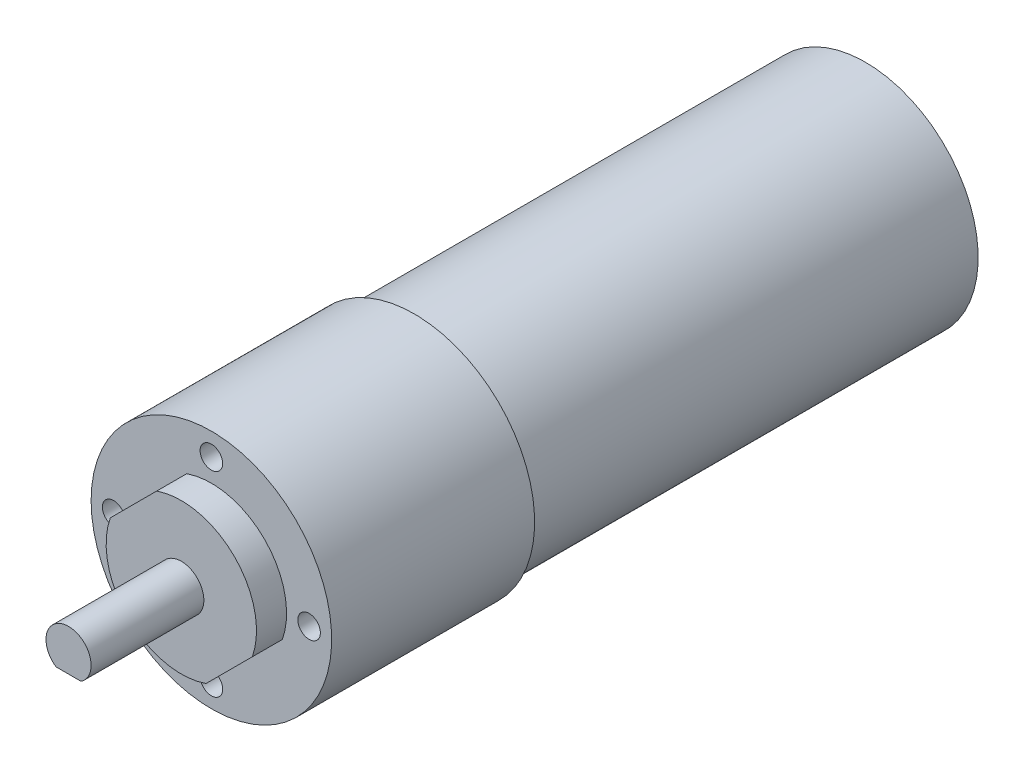
ISO-10303-21;
HEADER;
FILE_DESCRIPTION(('STEP AP214'),'2;1');
FILE_NAME('part.step','',(''),(''),'','','');
FILE_SCHEMA(('AUTOMOTIVE_DESIGN { 1 0 10303 214 1 1 1 1 }'));
ENDSEC;
DATA;
#1=APPLICATION_CONTEXT('core data for automotive mechanical design processes');
#2=APPLICATION_PROTOCOL_DEFINITION('international standard','automotive_design',2000,#1);
#3=PRODUCT_CONTEXT('',#1,'mechanical');
#4=PRODUCT('Part','Part','',(#3));
#5=PRODUCT_RELATED_PRODUCT_CATEGORY('part','',(#4));
#6=PRODUCT_DEFINITION_FORMATION('','',#4);
#7=PRODUCT_DEFINITION_CONTEXT('part definition',#1,'design');
#8=PRODUCT_DEFINITION('design','',#6,#7);
#9=PRODUCT_DEFINITION_SHAPE('','',#8);
#10=(LENGTH_UNIT() NAMED_UNIT(*) SI_UNIT(.MILLI.,.METRE.));
#11=(NAMED_UNIT(*) PLANE_ANGLE_UNIT() SI_UNIT($,.RADIAN.));
#12=(NAMED_UNIT(*) SI_UNIT($,.STERADIAN.) SOLID_ANGLE_UNIT());
#13=UNCERTAINTY_MEASURE_WITH_UNIT(LENGTH_MEASURE(1.E-05),#10,'distance_accuracy_value','');
#14=(GEOMETRIC_REPRESENTATION_CONTEXT(3) GLOBAL_UNCERTAINTY_ASSIGNED_CONTEXT((#13)) GLOBAL_UNIT_ASSIGNED_CONTEXT((#10,
#11,#12)) REPRESENTATION_CONTEXT('',''));
#15=CARTESIAN_POINT('',(0.,0.,0.));
#16=DIRECTION('',(0.,0.,1.));
#17=DIRECTION('',(1.,0.,0.));
#18=AXIS2_PLACEMENT_3D('',#15,#16,#17);
#19=CARTESIAN_POINT('',(0.,0.,-4.));
#20=DIRECTION('',(0.,0.,1.));
#21=DIRECTION('',(1.,0.,0.));
#22=AXIS2_PLACEMENT_3D('',#19,#20,#21);
#23=CYLINDRICAL_SURFACE('',#22,10.);
#24=DIRECTION('',(0.,0.,-1.));
#25=VECTOR('',#24,1.);
#26=CARTESIAN_POINT('',(9.4461680321634,-3.28175402919449,15.001));
#27=LINE('',#26,#25);
#28=CARTESIAN_POINT('',(9.4461680321634,-3.28175402919448,0.));
#29=VERTEX_POINT('',#28);
#30=CARTESIAN_POINT('',(9.4461680321634,-3.28175402919449,-4.));
#31=VERTEX_POINT('',#30);
#32=EDGE_CURVE('E60',#29,#31,#27,.T.);
#33=ORIENTED_EDGE('',*,*,#32,.T.);
#34=CARTESIAN_POINT('',(0.,0.,-4.));
#35=DIRECTION('',(0.,0.,-1.));
#36=DIRECTION('',(-1.,0.,0.));
#37=AXIS2_PLACEMENT_3D('',#34,#35,#36);
#38=CIRCLE('',#37,10.);
#39=CARTESIAN_POINT('',(-3.28175402919439,9.44616803216343,-4.));
#40=VERTEX_POINT('',#39);
#41=EDGE_CURVE('E98',#40,#31,#38,.T.);
#42=ORIENTED_EDGE('',*,*,#41,.F.);
#43=DIRECTION('',(0.,0.,-1.));
#44=VECTOR('',#43,1.);
#45=CARTESIAN_POINT('',(-3.28175402919439,9.44616803216343,15.001));
#46=LINE('',#45,#44);
#47=CARTESIAN_POINT('',(-3.2817540291944,9.44616803216343,0.));
#48=VERTEX_POINT('',#47);
#49=EDGE_CURVE('E101',#48,#40,#46,.T.);
#50=ORIENTED_EDGE('',*,*,#49,.F.);
#51=CARTESIAN_POINT('',(0.,0.,0.));
#52=DIRECTION('',(0.,0.,-1.));
#53=DIRECTION('',(-1.,0.,0.));
#54=AXIS2_PLACEMENT_3D('',#51,#52,#53);
#55=CIRCLE('',#54,10.);
#56=EDGE_CURVE('E126',#48,#29,#55,.T.);
#57=ORIENTED_EDGE('',*,*,#56,.T.);
#58=EDGE_LOOP('',(#33,#42,#50,#57));
#59=FACE_BOUND('',#58,.T.);
#60=ADVANCED_FACE('F42',(#59),#23,.T.);
#61=DIRECTION('',(0.,0.,-1.));
#62=VECTOR('',#61,1.);
#63=CARTESIAN_POINT('',(3.28175402919439,-9.44616803216343,15.001));
#64=LINE('',#63,#62);
#65=CARTESIAN_POINT('',(3.28175402919439,-9.44616803216343,0.));
#66=VERTEX_POINT('',#65);
#67=CARTESIAN_POINT('',(3.28175402919439,-9.44616803216343,-4.));
#68=VERTEX_POINT('',#67);
#69=EDGE_CURVE('E131',#66,#68,#64,.T.);
#70=ORIENTED_EDGE('',*,*,#69,.F.);
#71=CARTESIAN_POINT('',(-9.4461680321634,3.28175402919449,0.));
#72=VERTEX_POINT('',#71);
#73=EDGE_CURVE('E127',#66,#72,#55,.T.);
#74=ORIENTED_EDGE('',*,*,#73,.T.);
#75=DIRECTION('',(0.,0.,-1.));
#76=VECTOR('',#75,1.);
#77=CARTESIAN_POINT('',(-9.4461680321634,3.28175402919448,15.001));
#78=LINE('',#77,#76);
#79=CARTESIAN_POINT('',(-9.4461680321634,3.28175402919448,-4.));
#80=VERTEX_POINT('',#79);
#81=EDGE_CURVE('E68',#72,#80,#78,.T.);
#82=ORIENTED_EDGE('',*,*,#81,.T.);
#83=EDGE_CURVE('E107',#68,#80,#38,.T.);
#84=ORIENTED_EDGE('',*,*,#83,.F.);
#85=EDGE_LOOP('',(#70,#74,#82,#84));
#86=FACE_BOUND('',#85,.T.);
#87=ADVANCED_FACE('F174',(#86),#23,.T.);
#88=CARTESIAN_POINT('',(0.,0.,0.));
#89=DIRECTION('',(0.,0.,-1.));
#90=DIRECTION('',(-1.,0.,0.));
#91=AXIS2_PLACEMENT_3D('',#88,#89,#90);
#92=PLANE('',#91);
#93=CARTESIAN_POINT('',(0.,0.,0.));
#94=DIRECTION('',(0.,0.,1.));
#95=DIRECTION('',(1.,0.,0.));
#96=AXIS2_PLACEMENT_3D('',#93,#94,#95);
#97=CIRCLE('',#96,3.);
#98=CARTESIAN_POINT('',(3.,0.,0.));
#99=VERTEX_POINT('',#98);
#100=EDGE_CURVE('E46',#99,#99,#97,.T.);
#101=ORIENTED_EDGE('',*,*,#100,.F.);
#102=EDGE_LOOP('',(#101));
#103=FACE_BOUND('',#102,.T.);
#104=DIRECTION('',(0.707106781186551,0.707106781186544,0.));
#105=VECTOR('',#104,1.);
#106=CARTESIAN_POINT('',(6.36396103067889,-6.36396103067896,0.));
#107=LINE('',#106,#105);
#108=EDGE_CURVE('E118',#66,#29,#107,.T.);
#109=ORIENTED_EDGE('',*,*,#108,.T.);
#110=ORIENTED_EDGE('',*,*,#56,.F.);
#111=DIRECTION('',(-0.707106781186551,-0.707106781186544,0.));
#112=VECTOR('',#111,1.);
#113=CARTESIAN_POINT('',(-9.4461680321634,3.28175402919448,0.));
#114=LINE('',#113,#112);
#115=EDGE_CURVE('E111',#48,#72,#114,.T.);
#116=ORIENTED_EDGE('',*,*,#115,.T.);
#117=ORIENTED_EDGE('',*,*,#73,.F.);
#118=EDGE_LOOP('',(#109,#110,#116,#117));
#119=FACE_BOUND('',#118,.T.);
#120=ADVANCED_FACE('F178',(#103,#119),#92,.F.);
#121=CARTESIAN_POINT('',(0.,0.,15.));
#122=DIRECTION('',(0.,0.,-1.));
#123=DIRECTION('',(-1.,0.,0.));
#124=AXIS2_PLACEMENT_3D('',#121,#122,#123);
#125=CYLINDRICAL_SURFACE('',#124,3.);
#126=CARTESIAN_POINT('',(0.,0.,15.));
#127=DIRECTION('',(0.,0.,1.));
#128=DIRECTION('',(1.,0.,0.));
#129=AXIS2_PLACEMENT_3D('',#126,#127,#128);
#130=CIRCLE('',#129,3.);
#131=CARTESIAN_POINT('',(1.6583123951777,-2.5,15.));
#132=VERTEX_POINT('',#131);
#133=CARTESIAN_POINT('',(-1.6583123951777,-2.5,15.));
#134=VERTEX_POINT('',#133);
#135=EDGE_CURVE('E52',#132,#134,#130,.T.);
#136=ORIENTED_EDGE('',*,*,#135,.F.);
#137=DIRECTION('',(0.,0.,1.));
#138=VECTOR('',#137,1.);
#139=CARTESIAN_POINT('',(1.6583123951777,-2.5,3.));
#140=LINE('',#139,#138);
#141=CARTESIAN_POINT('',(1.6583123951777,-2.5,3.));
#142=VERTEX_POINT('',#141);
#143=EDGE_CURVE('E140',#142,#132,#140,.T.);
#144=ORIENTED_EDGE('',*,*,#143,.F.);
#145=CARTESIAN_POINT('',(0.,0.,3.));
#146=DIRECTION('',(0.,0.,1.));
#147=DIRECTION('',(1.,0.,0.));
#148=AXIS2_PLACEMENT_3D('',#145,#146,#147);
#149=CIRCLE('',#148,3.);
#150=CARTESIAN_POINT('',(-1.6583123951777,-2.5,3.));
#151=VERTEX_POINT('',#150);
#152=EDGE_CURVE('E132',#151,#142,#149,.T.);
#153=ORIENTED_EDGE('',*,*,#152,.F.);
#154=DIRECTION('',(0.,0.,1.));
#155=VECTOR('',#154,1.);
#156=CARTESIAN_POINT('',(-1.6583123951777,-2.5,3.));
#157=LINE('',#156,#155);
#158=EDGE_CURVE('E143',#151,#134,#157,.T.);
#159=ORIENTED_EDGE('',*,*,#158,.T.);
#160=EDGE_LOOP('',(#136,#144,#153,#159));
#161=FACE_BOUND('',#160,.T.);
#162=ORIENTED_EDGE('',*,*,#100,.T.);
#163=EDGE_LOOP('',(#162));
#164=FACE_BOUND('',#163,.T.);
#165=ADVANCED_FACE('F44',(#161,#164),#125,.T.);
#166=CARTESIAN_POINT('',(0.,0.,15.));
#167=DIRECTION('',(0.,0.,1.));
#168=DIRECTION('',(1.,0.,0.));
#169=AXIS2_PLACEMENT_3D('',#166,#167,#168);
#170=PLANE('',#169);
#171=DIRECTION('',(-1.,0.,0.));
#172=VECTOR('',#171,1.);
#173=CARTESIAN_POINT('',(1.6583123951777,-2.5,15.));
#174=LINE('',#173,#172);
#175=EDGE_CURVE('E136',#132,#134,#174,.T.);
#176=ORIENTED_EDGE('',*,*,#175,.F.);
#177=ORIENTED_EDGE('',*,*,#135,.T.);
#178=EDGE_LOOP('',(#176,#177));
#179=FACE_BOUND('',#178,.T.);
#180=ADVANCED_FACE('F153',(#179),#170,.T.);
#181=CARTESIAN_POINT('',(1.6583123951777,-2.5,3.));
#182=DIRECTION('',(0.,1.,0.));
#183=DIRECTION('',(0.,0.,1.));
#184=AXIS2_PLACEMENT_3D('',#181,#182,#183);
#185=PLANE('',#184);
#186=ORIENTED_EDGE('',*,*,#175,.T.);
#187=ORIENTED_EDGE('',*,*,#158,.F.);
#188=DIRECTION('',(-1.,0.,0.));
#189=VECTOR('',#188,1.);
#190=CARTESIAN_POINT('',(1.6583123951777,-2.5,3.));
#191=LINE('',#190,#189);
#192=EDGE_CURVE('E135',#142,#151,#191,.T.);
#193=ORIENTED_EDGE('',*,*,#192,.F.);
#194=ORIENTED_EDGE('',*,*,#143,.T.);
#195=EDGE_LOOP('',(#186,#187,#193,#194));
#196=FACE_BOUND('',#195,.T.);
#197=ADVANCED_FACE('F160',(#196),#185,.F.);
#198=CARTESIAN_POINT('',(0.,0.,3.));
#199=DIRECTION('',(0.,0.,1.));
#200=DIRECTION('',(1.,0.,0.));
#201=AXIS2_PLACEMENT_3D('',#198,#199,#200);
#202=PLANE('',#201);
#203=ORIENTED_EDGE('',*,*,#152,.T.);
#204=ORIENTED_EDGE('',*,*,#192,.T.);
#205=EDGE_LOOP('',(#203,#204));
#206=FACE_BOUND('',#205,.T.);
#207=ADVANCED_FACE('F162',(#206),#202,.T.);
#208=CARTESIAN_POINT('',(-9.4461680321634,3.28175402919448,15.001));
#209=DIRECTION('',(-0.707106781186544,0.707106781186551,0.));
#210=DIRECTION('',(-0.707106781186551,-0.707106781186544,0.));
#211=AXIS2_PLACEMENT_3D('',#208,#209,#210);
#212=PLANE('',#211);
#213=ORIENTED_EDGE('',*,*,#49,.T.);
#214=DIRECTION('',(0.707106781186551,0.707106781186544,0.));
#215=VECTOR('',#214,1.);
#216=CARTESIAN_POINT('',(-9.4461680321634,3.28175402919448,-4.));
#217=LINE('',#216,#215);
#218=EDGE_CURVE('E110',#80,#40,#217,.T.);
#219=ORIENTED_EDGE('',*,*,#218,.F.);
#220=ORIENTED_EDGE('',*,*,#81,.F.);
#221=ORIENTED_EDGE('',*,*,#115,.F.);
#222=EDGE_LOOP('',(#213,#219,#220,#221));
#223=FACE_BOUND('',#222,.T.);
#224=ADVANCED_FACE('F109',(#223),#212,.T.);
#225=CARTESIAN_POINT('',(6.36396103067889,-6.36396103067896,15.001));
#226=DIRECTION('',(0.707106781186544,-0.707106781186551,0.));
#227=DIRECTION('',(0.707106781186551,0.707106781186544,0.));
#228=AXIS2_PLACEMENT_3D('',#225,#226,#227);
#229=PLANE('',#228);
#230=ORIENTED_EDGE('',*,*,#69,.T.);
#231=DIRECTION('',(-0.707106781186551,-0.707106781186544,0.));
#232=VECTOR('',#231,1.);
#233=CARTESIAN_POINT('',(6.36396103067889,-6.36396103067896,-4.));
#234=LINE('',#233,#232);
#235=EDGE_CURVE('E121',#31,#68,#234,.T.);
#236=ORIENTED_EDGE('',*,*,#235,.F.);
#237=ORIENTED_EDGE('',*,*,#32,.F.);
#238=ORIENTED_EDGE('',*,*,#108,.F.);
#239=EDGE_LOOP('',(#230,#236,#237,#238));
#240=FACE_BOUND('',#239,.T.);
#241=ADVANCED_FACE('F169',(#240),#229,.T.);
#242=CARTESIAN_POINT('',(0.,0.,-4.));
#243=DIRECTION('',(0.,0.,-1.));
#244=DIRECTION('',(-1.,0.,0.));
#245=AXIS2_PLACEMENT_3D('',#242,#243,#244);
#246=PLANE('',#245);
#247=CARTESIAN_POINT('',(0.,13.,-4.));
#248=DIRECTION('',(0.,0.,1.));
#249=DIRECTION('',(1.,0.,0.));
#250=AXIS2_PLACEMENT_3D('',#247,#248,#249);
#251=CIRCLE('',#250,1.5);
#252=CARTESIAN_POINT('',(1.5,13.,-4.));
#253=VERTEX_POINT('',#252);
#254=EDGE_CURVE('E243',#253,#253,#251,.T.);
#255=ORIENTED_EDGE('',*,*,#254,.F.);
#256=EDGE_LOOP('',(#255));
#257=FACE_BOUND('',#256,.T.);
#258=CARTESIAN_POINT('',(13.,0.,-4.));
#259=DIRECTION('',(0.,0.,1.));
#260=DIRECTION('',(1.,0.,0.));
#261=AXIS2_PLACEMENT_3D('',#258,#259,#260);
#262=CIRCLE('',#261,1.5);
#263=CARTESIAN_POINT('',(14.5,0.,-4.));
#264=VERTEX_POINT('',#263);
#265=EDGE_CURVE('E251',#264,#264,#262,.T.);
#266=ORIENTED_EDGE('',*,*,#265,.F.);
#267=EDGE_LOOP('',(#266));
#268=FACE_BOUND('',#267,.T.);
#269=CARTESIAN_POINT('',(0.,-13.,-4.));
#270=DIRECTION('',(0.,0.,1.));
#271=DIRECTION('',(1.,0.,0.));
#272=AXIS2_PLACEMENT_3D('',#269,#270,#271);
#273=CIRCLE('',#272,1.5);
#274=CARTESIAN_POINT('',(1.49999999999991,-13.,-4.));
#275=VERTEX_POINT('',#274);
#276=EDGE_CURVE('E261',#275,#275,#273,.T.);
#277=ORIENTED_EDGE('',*,*,#276,.F.);
#278=EDGE_LOOP('',(#277));
#279=FACE_BOUND('',#278,.T.);
#280=CARTESIAN_POINT('',(-13.,1.36167772214882E-13,-4.));
#281=DIRECTION('',(0.,0.,1.));
#282=DIRECTION('',(1.,0.,0.));
#283=AXIS2_PLACEMENT_3D('',#280,#281,#282);
#284=CIRCLE('',#283,1.5);
#285=CARTESIAN_POINT('',(-11.5,1.36167772214882E-13,-4.));
#286=VERTEX_POINT('',#285);
#287=EDGE_CURVE('E269',#286,#286,#284,.T.);
#288=ORIENTED_EDGE('',*,*,#287,.F.);
#289=EDGE_LOOP('',(#288));
#290=FACE_BOUND('',#289,.T.);
#291=CARTESIAN_POINT('',(0.,0.,-4.));
#292=DIRECTION('',(0.,0.,-1.));
#293=DIRECTION('',(-1.,0.,0.));
#294=AXIS2_PLACEMENT_3D('',#291,#292,#293);
#295=CIRCLE('',#294,16.);
#296=CARTESIAN_POINT('',(-16.,0.,-4.));
#297=VERTEX_POINT('',#296);
#298=EDGE_CURVE('E248',#297,#297,#295,.T.);
#299=ORIENTED_EDGE('',*,*,#298,.F.);
#300=EDGE_LOOP('',(#299));
#301=FACE_BOUND('',#300,.T.);
#302=ORIENTED_EDGE('',*,*,#218,.T.);
#303=ORIENTED_EDGE('',*,*,#41,.T.);
#304=ORIENTED_EDGE('',*,*,#235,.T.);
#305=ORIENTED_EDGE('',*,*,#83,.T.);
#306=EDGE_LOOP('',(#302,#303,#304,#305));
#307=FACE_BOUND('',#306,.T.);
#308=ADVANCED_FACE('F115',(#257,#268,#279,#290,#301,#307),#246,.F.);
#309=CARTESIAN_POINT('',(0.,0.,-31.));
#310=DIRECTION('',(0.,0.,1.));
#311=DIRECTION('',(1.,0.,0.));
#312=AXIS2_PLACEMENT_3D('',#309,#310,#311);
#313=CYLINDRICAL_SURFACE('',#312,16.);
#314=CARTESIAN_POINT('',(0.,0.,-31.));
#315=DIRECTION('',(0.,0.,-1.));
#316=DIRECTION('',(-1.,0.,0.));
#317=AXIS2_PLACEMENT_3D('',#314,#315,#316);
#318=CIRCLE('',#317,16.);
#319=CARTESIAN_POINT('',(-16.,0.,-31.));
#320=VERTEX_POINT('',#319);
#321=EDGE_CURVE('E277',#320,#320,#318,.T.);
#322=ORIENTED_EDGE('',*,*,#321,.F.);
#323=EDGE_LOOP('',(#322));
#324=FACE_BOUND('',#323,.T.);
#325=ORIENTED_EDGE('',*,*,#298,.T.);
#326=EDGE_LOOP('',(#325));
#327=FACE_BOUND('',#326,.T.);
#328=ADVANCED_FACE('F186',(#324,#327),#313,.T.);
#329=CARTESIAN_POINT('',(0.,0.,-31.));
#330=DIRECTION('',(0.,0.,-1.));
#331=DIRECTION('',(-1.,0.,0.));
#332=AXIS2_PLACEMENT_3D('',#329,#330,#331);
#333=PLANE('',#332);
#334=CARTESIAN_POINT('',(0.,0.,-31.));
#335=DIRECTION('',(0.,0.,-1.));
#336=DIRECTION('',(-1.,0.,0.));
#337=AXIS2_PLACEMENT_3D('',#334,#335,#336);
#338=CIRCLE('',#337,15.);
#339=CARTESIAN_POINT('',(-15.,0.,-31.));
#340=VERTEX_POINT('',#339);
#341=EDGE_CURVE('E11',#340,#340,#338,.T.);
#342=ORIENTED_EDGE('',*,*,#341,.F.);
#343=EDGE_LOOP('',(#342));
#344=FACE_BOUND('',#343,.T.);
#345=ORIENTED_EDGE('',*,*,#321,.T.);
#346=EDGE_LOOP('',(#345));
#347=FACE_BOUND('',#346,.T.);
#348=ADVANCED_FACE('F189',(#344,#347),#333,.T.);
#349=CARTESIAN_POINT('',(0.,0.,-91.));
#350=DIRECTION('',(0.,0.,1.));
#351=DIRECTION('',(1.,0.,0.));
#352=AXIS2_PLACEMENT_3D('',#349,#350,#351);
#353=CYLINDRICAL_SURFACE('',#352,15.);
#354=CARTESIAN_POINT('',(0.,0.,-91.));
#355=DIRECTION('',(0.,0.,-1.));
#356=DIRECTION('',(-1.,0.,0.));
#357=AXIS2_PLACEMENT_3D('',#354,#355,#356);
#358=CIRCLE('',#357,15.);
#359=CARTESIAN_POINT('',(-15.,0.,-91.));
#360=VERTEX_POINT('',#359);
#361=EDGE_CURVE('E242',#360,#360,#358,.T.);
#362=ORIENTED_EDGE('',*,*,#361,.F.);
#363=EDGE_LOOP('',(#362));
#364=FACE_BOUND('',#363,.T.);
#365=ORIENTED_EDGE('',*,*,#341,.T.);
#366=EDGE_LOOP('',(#365));
#367=FACE_BOUND('',#366,.T.);
#368=ADVANCED_FACE('F196',(#364,#367),#353,.T.);
#369=CARTESIAN_POINT('',(0.,0.,-91.));
#370=DIRECTION('',(0.,0.,-1.));
#371=DIRECTION('',(-1.,0.,0.));
#372=AXIS2_PLACEMENT_3D('',#369,#370,#371);
#373=PLANE('',#372);
#374=ORIENTED_EDGE('',*,*,#361,.T.);
#375=EDGE_LOOP('',(#374));
#376=FACE_BOUND('',#375,.T.);
#377=ADVANCED_FACE('F200',(#376),#373,.T.);
#378=CARTESIAN_POINT('',(-13.,1.36167772214882E-13,-9.));
#379=DIRECTION('',(0.,0.,1.));
#380=DIRECTION('',(1.,0.,0.));
#381=AXIS2_PLACEMENT_3D('',#378,#379,#380);
#382=CYLINDRICAL_SURFACE('',#381,1.5);
#383=CARTESIAN_POINT('',(-13.,1.36167772214882E-13,-9.));
#384=DIRECTION('',(0.,0.,1.));
#385=DIRECTION('',(1.,0.,0.));
#386=AXIS2_PLACEMENT_3D('',#383,#384,#385);
#387=CIRCLE('',#386,1.5);
#388=CARTESIAN_POINT('',(-11.5,1.36167772214882E-13,-9.));
#389=VERTEX_POINT('',#388);
#390=EDGE_CURVE('E273',#389,#389,#387,.T.);
#391=ORIENTED_EDGE('',*,*,#390,.F.);
#392=EDGE_LOOP('',(#391));
#393=FACE_BOUND('',#392,.T.);
#394=ORIENTED_EDGE('',*,*,#287,.T.);
#395=EDGE_LOOP('',(#394));
#396=FACE_BOUND('',#395,.T.);
#397=ADVANCED_FACE('F204',(#393,#396),#382,.F.);
#398=CARTESIAN_POINT('',(-13.,1.36167772214882E-13,-9.));
#399=DIRECTION('',(0.,0.,1.));
#400=DIRECTION('',(1.,0.,0.));
#401=AXIS2_PLACEMENT_3D('',#398,#399,#400);
#402=PLANE('',#401);
#403=ORIENTED_EDGE('',*,*,#390,.T.);
#404=EDGE_LOOP('',(#403));
#405=FACE_BOUND('',#404,.T.);
#406=ADVANCED_FACE('F206',(#405),#402,.T.);
#407=CARTESIAN_POINT('',(0.,-13.,-9.));
#408=DIRECTION('',(0.,0.,1.));
#409=DIRECTION('',(1.,0.,0.));
#410=AXIS2_PLACEMENT_3D('',#407,#408,#409);
#411=CYLINDRICAL_SURFACE('',#410,1.5);
#412=CARTESIAN_POINT('',(0.,-13.,-9.));
#413=DIRECTION('',(0.,0.,1.));
#414=DIRECTION('',(1.,0.,0.));
#415=AXIS2_PLACEMENT_3D('',#412,#413,#414);
#416=CIRCLE('',#415,1.5);
#417=CARTESIAN_POINT('',(1.49999999999991,-13.,-9.));
#418=VERTEX_POINT('',#417);
#419=EDGE_CURVE('E265',#418,#418,#416,.T.);
#420=ORIENTED_EDGE('',*,*,#419,.F.);
#421=EDGE_LOOP('',(#420));
#422=FACE_BOUND('',#421,.T.);
#423=ORIENTED_EDGE('',*,*,#276,.T.);
#424=EDGE_LOOP('',(#423));
#425=FACE_BOUND('',#424,.T.);
#426=ADVANCED_FACE('F209',(#422,#425),#411,.F.);
#427=CARTESIAN_POINT('',(0.,-13.,-9.));
#428=DIRECTION('',(0.,0.,1.));
#429=DIRECTION('',(1.,0.,0.));
#430=AXIS2_PLACEMENT_3D('',#427,#428,#429);
#431=PLANE('',#430);
#432=ORIENTED_EDGE('',*,*,#419,.T.);
#433=EDGE_LOOP('',(#432));
#434=FACE_BOUND('',#433,.T.);
#435=ADVANCED_FACE('F214',(#434),#431,.T.);
#436=CARTESIAN_POINT('',(13.,0.,-9.));
#437=DIRECTION('',(0.,0.,1.));
#438=DIRECTION('',(1.,0.,0.));
#439=AXIS2_PLACEMENT_3D('',#436,#437,#438);
#440=CYLINDRICAL_SURFACE('',#439,1.5);
#441=CARTESIAN_POINT('',(13.,0.,-9.));
#442=DIRECTION('',(0.,0.,1.));
#443=DIRECTION('',(1.,0.,0.));
#444=AXIS2_PLACEMENT_3D('',#441,#442,#443);
#445=CIRCLE('',#444,1.5);
#446=CARTESIAN_POINT('',(14.5,0.,-9.));
#447=VERTEX_POINT('',#446);
#448=EDGE_CURVE('E257',#447,#447,#445,.T.);
#449=ORIENTED_EDGE('',*,*,#448,.F.);
#450=EDGE_LOOP('',(#449));
#451=FACE_BOUND('',#450,.T.);
#452=ORIENTED_EDGE('',*,*,#265,.T.);
#453=EDGE_LOOP('',(#452));
#454=FACE_BOUND('',#453,.T.);
#455=ADVANCED_FACE('F217',(#451,#454),#440,.F.);
#456=CARTESIAN_POINT('',(13.,0.,-9.));
#457=DIRECTION('',(0.,0.,1.));
#458=DIRECTION('',(1.,0.,0.));
#459=AXIS2_PLACEMENT_3D('',#456,#457,#458);
#460=PLANE('',#459);
#461=ORIENTED_EDGE('',*,*,#448,.T.);
#462=EDGE_LOOP('',(#461));
#463=FACE_BOUND('',#462,.T.);
#464=ADVANCED_FACE('F222',(#463),#460,.T.);
#465=CARTESIAN_POINT('',(0.,13.,-9.));
#466=DIRECTION('',(0.,0.,1.));
#467=DIRECTION('',(1.,0.,0.));
#468=AXIS2_PLACEMENT_3D('',#465,#466,#467);
#469=CYLINDRICAL_SURFACE('',#468,1.5);
#470=CARTESIAN_POINT('',(0.,13.,-9.));
#471=DIRECTION('',(0.,0.,1.));
#472=DIRECTION('',(1.,0.,0.));
#473=AXIS2_PLACEMENT_3D('',#470,#471,#472);
#474=CIRCLE('',#473,1.5);
#475=CARTESIAN_POINT('',(1.5,13.,-9.));
#476=VERTEX_POINT('',#475);
#477=EDGE_CURVE('E240',#476,#476,#474,.T.);
#478=ORIENTED_EDGE('',*,*,#477,.F.);
#479=EDGE_LOOP('',(#478));
#480=FACE_BOUND('',#479,.T.);
#481=ORIENTED_EDGE('',*,*,#254,.T.);
#482=EDGE_LOOP('',(#481));
#483=FACE_BOUND('',#482,.T.);
#484=ADVANCED_FACE('F225',(#480,#483),#469,.F.);
#485=CARTESIAN_POINT('',(0.,13.,-9.));
#486=DIRECTION('',(0.,0.,1.));
#487=DIRECTION('',(1.,0.,0.));
#488=AXIS2_PLACEMENT_3D('',#485,#486,#487);
#489=PLANE('',#488);
#490=ORIENTED_EDGE('',*,*,#477,.T.);
#491=EDGE_LOOP('',(#490));
#492=FACE_BOUND('',#491,.T.);
#493=ADVANCED_FACE('F232',(#492),#489,.T.);
#494=CLOSED_SHELL('',(#60,#87,#120,#165,#180,#197,#207,#224,#241,#308,#328,#348,#368,#377,#397,
#406,#426,#435,#455,#464,#484,#493));
#495=MANIFOLD_SOLID_BREP('B2',#494);
#496=ADVANCED_BREP_SHAPE_REPRESENTATION('',(#18,#495),#14);
#497=SHAPE_DEFINITION_REPRESENTATION(#9,#496);
ENDSEC;
END-ISO-10303-21;
